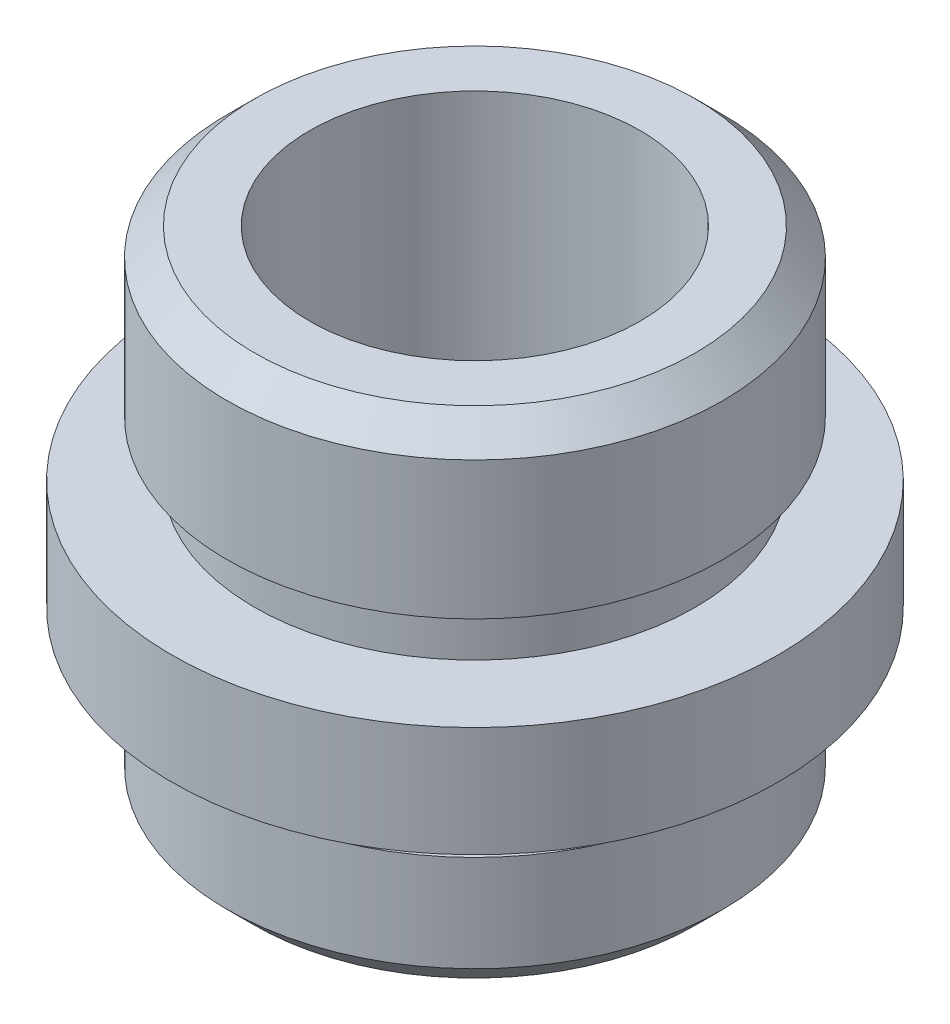
ISO-10303-21;
HEADER;
FILE_DESCRIPTION(('STEP AP214'),'2;1');
FILE_NAME('part.step','',(''),(''),'','','');
FILE_SCHEMA(('AUTOMOTIVE_DESIGN { 1 0 10303 214 1 1 1 1 }'));
ENDSEC;
DATA;
#1=APPLICATION_CONTEXT('core data for automotive mechanical design processes');
#2=APPLICATION_PROTOCOL_DEFINITION('international standard','automotive_design',2000,#1);
#3=PRODUCT_CONTEXT('',#1,'mechanical');
#4=PRODUCT('Part','Part','',(#3));
#5=PRODUCT_RELATED_PRODUCT_CATEGORY('part','',(#4));
#6=PRODUCT_DEFINITION_FORMATION('','',#4);
#7=PRODUCT_DEFINITION_CONTEXT('part definition',#1,'design');
#8=PRODUCT_DEFINITION('design','',#6,#7);
#9=PRODUCT_DEFINITION_SHAPE('','',#8);
#10=(LENGTH_UNIT() NAMED_UNIT(*) SI_UNIT(.MILLI.,.METRE.));
#11=(NAMED_UNIT(*) PLANE_ANGLE_UNIT() SI_UNIT($,.RADIAN.));
#12=(NAMED_UNIT(*) SI_UNIT($,.STERADIAN.) SOLID_ANGLE_UNIT());
#13=UNCERTAINTY_MEASURE_WITH_UNIT(LENGTH_MEASURE(1.E-05),#10,'distance_accuracy_value','');
#14=(GEOMETRIC_REPRESENTATION_CONTEXT(3) GLOBAL_UNCERTAINTY_ASSIGNED_CONTEXT((#13)) GLOBAL_UNIT_ASSIGNED_CONTEXT((#10,
#11,#12)) REPRESENTATION_CONTEXT('',''));
#15=CARTESIAN_POINT('',(0.,0.,0.));
#16=DIRECTION('',(0.,0.,1.));
#17=DIRECTION('',(1.,0.,0.));
#18=AXIS2_PLACEMENT_3D('',#15,#16,#17);
#19=CARTESIAN_POINT('',(-12.,0.,0.));
#20=DIRECTION('',(0.,-1.,0.));
#21=DIRECTION('',(1.,0.,0.));
#22=AXIS2_PLACEMENT_3D('',#19,#20,#21);
#23=PLANE('',#22);
#24=CARTESIAN_POINT('',(0.,0.,0.));
#25=DIRECTION('',(0.,-1.,0.));
#26=DIRECTION('',(1.,0.,0.));
#27=AXIS2_PLACEMENT_3D('',#24,#25,#26);
#28=CIRCLE('',#27,16.);
#29=CARTESIAN_POINT('',(16.,0.,0.));
#30=VERTEX_POINT('',#29);
#31=EDGE_CURVE('E10',#30,#30,#28,.T.);
#32=ORIENTED_EDGE('',*,*,#31,.F.);
#33=EDGE_LOOP('',(#32));
#34=FACE_BOUND('',#33,.T.);
#35=CARTESIAN_POINT('',(0.,0.,0.));
#36=DIRECTION('',(0.,-1.,0.));
#37=DIRECTION('',(1.,0.,0.));
#38=AXIS2_PLACEMENT_3D('',#35,#36,#37);
#39=CIRCLE('',#38,12.);
#40=CARTESIAN_POINT('',(12.,0.,0.));
#41=VERTEX_POINT('',#40);
#42=EDGE_CURVE('E81',#41,#41,#39,.T.);
#43=ORIENTED_EDGE('',*,*,#42,.T.);
#44=EDGE_LOOP('',(#43));
#45=FACE_BOUND('',#44,.T.);
#46=ADVANCED_FACE('F35',(#34,#45),#23,.F.);
#47=CARTESIAN_POINT('',(0.,0.,0.));
#48=DIRECTION('',(0.,-1.,0.));
#49=DIRECTION('',(1.,0.,0.));
#50=AXIS2_PLACEMENT_3D('',#47,#48,#49);
#51=CONICAL_SURFACE('',#50,16.,0.785398163397478);
#52=CARTESIAN_POINT('',(0.,-1.99999999999989,0.));
#53=DIRECTION('',(0.,-1.,0.));
#54=DIRECTION('',(1.,0.,0.));
#55=AXIS2_PLACEMENT_3D('',#52,#53,#54);
#56=CIRCLE('',#55,18.);
#57=CARTESIAN_POINT('',(18.,-1.99999999999983,0.));
#58=VERTEX_POINT('',#57);
#59=EDGE_CURVE('E41',#58,#58,#56,.T.);
#60=ORIENTED_EDGE('',*,*,#59,.F.);
#61=EDGE_LOOP('',(#60));
#62=FACE_BOUND('',#61,.T.);
#63=ORIENTED_EDGE('',*,*,#31,.T.);
#64=EDGE_LOOP('',(#63));
#65=FACE_BOUND('',#64,.T.);
#66=ADVANCED_FACE('F154',(#62,#65),#51,.T.);
#67=CARTESIAN_POINT('',(3.43024899888577E-12,-1000.,0.));
#68=DIRECTION('',(0.,-1.,0.));
#69=DIRECTION('',(1.,0.,0.));
#70=AXIS2_PLACEMENT_3D('',#67,#68,#69);
#71=CYLINDRICAL_SURFACE('',#70,18.);
#72=CARTESIAN_POINT('',(0.,-11.9999999999999,0.));
#73=DIRECTION('',(0.,-1.,0.));
#74=DIRECTION('',(1.,0.,0.));
#75=AXIS2_PLACEMENT_3D('',#72,#73,#74);
#76=CIRCLE('',#75,18.);
#77=CARTESIAN_POINT('',(18.0000000000001,-11.9999999999998,0.));
#78=VERTEX_POINT('',#77);
#79=EDGE_CURVE('E45',#78,#78,#76,.T.);
#80=ORIENTED_EDGE('',*,*,#79,.F.);
#81=EDGE_LOOP('',(#80));
#82=FACE_BOUND('',#81,.T.);
#83=ORIENTED_EDGE('',*,*,#59,.T.);
#84=EDGE_LOOP('',(#83));
#85=FACE_BOUND('',#84,.T.);
#86=ADVANCED_FACE('F149',(#82,#85),#71,.T.);
#87=CARTESIAN_POINT('',(-18.,-12.,0.));
#88=DIRECTION('',(0.,1.,0.));
#89=DIRECTION('',(-1.,0.,0.));
#90=AXIS2_PLACEMENT_3D('',#87,#88,#89);
#91=PLANE('',#90);
#92=CARTESIAN_POINT('',(0.,-12.,0.));
#93=DIRECTION('',(0.,-1.,0.));
#94=DIRECTION('',(1.,0.,0.));
#95=AXIS2_PLACEMENT_3D('',#92,#93,#94);
#96=CIRCLE('',#95,16.);
#97=CARTESIAN_POINT('',(16.0000000000001,-12.,0.));
#98=VERTEX_POINT('',#97);
#99=EDGE_CURVE('E49',#98,#98,#96,.T.);
#100=ORIENTED_EDGE('',*,*,#99,.F.);
#101=EDGE_LOOP('',(#100));
#102=FACE_BOUND('',#101,.T.);
#103=ORIENTED_EDGE('',*,*,#79,.T.);
#104=EDGE_LOOP('',(#103));
#105=FACE_BOUND('',#104,.T.);
#106=ADVANCED_FACE('F143',(#102,#105),#91,.F.);
#107=CARTESIAN_POINT('',(3.43024899888577E-12,-1000.,0.));
#108=DIRECTION('',(0.,-1.,0.));
#109=DIRECTION('',(1.,0.,0.));
#110=AXIS2_PLACEMENT_3D('',#107,#108,#109);
#111=CYLINDRICAL_SURFACE('',#110,16.);
#112=CARTESIAN_POINT('',(0.,-16.,0.));
#113=DIRECTION('',(0.,-1.,0.));
#114=DIRECTION('',(1.,0.,0.));
#115=AXIS2_PLACEMENT_3D('',#112,#113,#114);
#116=CIRCLE('',#115,16.0000000000001);
#117=CARTESIAN_POINT('',(16.0000000000001,-16.,0.));
#118=VERTEX_POINT('',#117);
#119=EDGE_CURVE('E54',#118,#118,#116,.T.);
#120=ORIENTED_EDGE('',*,*,#119,.F.);
#121=EDGE_LOOP('',(#120));
#122=FACE_BOUND('',#121,.T.);
#123=ORIENTED_EDGE('',*,*,#99,.T.);
#124=EDGE_LOOP('',(#123));
#125=FACE_BOUND('',#124,.T.);
#126=ADVANCED_FACE('F137',(#122,#125),#111,.T.);
#127=CARTESIAN_POINT('',(-16.,-16.,0.));
#128=DIRECTION('',(0.,-1.,0.));
#129=DIRECTION('',(1.,0.,0.));
#130=AXIS2_PLACEMENT_3D('',#127,#128,#129);
#131=PLANE('',#130);
#132=CARTESIAN_POINT('',(0.,-15.9999999999999,0.));
#133=DIRECTION('',(0.,-1.,0.));
#134=DIRECTION('',(1.,0.,0.));
#135=AXIS2_PLACEMENT_3D('',#132,#133,#134);
#136=CIRCLE('',#135,22.0000000000001);
#137=CARTESIAN_POINT('',(22.0000000000001,-15.9999999999998,0.));
#138=VERTEX_POINT('',#137);
#139=EDGE_CURVE('E57',#138,#138,#136,.T.);
#140=ORIENTED_EDGE('',*,*,#139,.F.);
#141=EDGE_LOOP('',(#140));
#142=FACE_BOUND('',#141,.T.);
#143=ORIENTED_EDGE('',*,*,#119,.T.);
#144=EDGE_LOOP('',(#143));
#145=FACE_BOUND('',#144,.T.);
#146=ADVANCED_FACE('F131',(#142,#145),#131,.F.);
#147=CARTESIAN_POINT('',(3.43024899888577E-12,-1000.,0.));
#148=DIRECTION('',(0.,-1.,0.));
#149=DIRECTION('',(1.,0.,0.));
#150=AXIS2_PLACEMENT_3D('',#147,#148,#149);
#151=CYLINDRICAL_SURFACE('',#150,22.0000000000001);
#152=CARTESIAN_POINT('',(0.,-23.9999999999999,0.));
#153=DIRECTION('',(0.,-1.,0.));
#154=DIRECTION('',(1.,0.,0.));
#155=AXIS2_PLACEMENT_3D('',#152,#153,#154);
#156=CIRCLE('',#155,22.0000000000001);
#157=CARTESIAN_POINT('',(22.0000000000002,-23.9999999999998,0.));
#158=VERTEX_POINT('',#157);
#159=EDGE_CURVE('E60',#158,#158,#156,.T.);
#160=ORIENTED_EDGE('',*,*,#159,.F.);
#161=EDGE_LOOP('',(#160));
#162=FACE_BOUND('',#161,.T.);
#163=ORIENTED_EDGE('',*,*,#139,.T.);
#164=EDGE_LOOP('',(#163));
#165=FACE_BOUND('',#164,.T.);
#166=ADVANCED_FACE('F125',(#162,#165),#151,.T.);
#167=CARTESIAN_POINT('',(-22.,-24.,0.));
#168=DIRECTION('',(0.,1.,0.));
#169=DIRECTION('',(-1.,0.,0.));
#170=AXIS2_PLACEMENT_3D('',#167,#168,#169);
#171=PLANE('',#170);
#172=CARTESIAN_POINT('',(0.,-24.,0.));
#173=DIRECTION('',(0.,-1.,0.));
#174=DIRECTION('',(1.,0.,0.));
#175=AXIS2_PLACEMENT_3D('',#172,#173,#174);
#176=CIRCLE('',#175,16.0000000000001);
#177=CARTESIAN_POINT('',(16.0000000000002,-24.,0.));
#178=VERTEX_POINT('',#177);
#179=EDGE_CURVE('E63',#178,#178,#176,.T.);
#180=ORIENTED_EDGE('',*,*,#179,.F.);
#181=EDGE_LOOP('',(#180));
#182=FACE_BOUND('',#181,.T.);
#183=ORIENTED_EDGE('',*,*,#159,.T.);
#184=EDGE_LOOP('',(#183));
#185=FACE_BOUND('',#184,.T.);
#186=ADVANCED_FACE('F119',(#182,#185),#171,.F.);
#187=CARTESIAN_POINT('',(3.43024899888577E-12,-1000.,0.));
#188=DIRECTION('',(0.,-1.,0.));
#189=DIRECTION('',(1.,0.,0.));
#190=AXIS2_PLACEMENT_3D('',#187,#188,#189);
#191=CYLINDRICAL_SURFACE('',#190,16.0000000000001);
#192=CARTESIAN_POINT('',(0.,-27.,0.));
#193=DIRECTION('',(0.,-1.,0.));
#194=DIRECTION('',(1.,0.,0.));
#195=AXIS2_PLACEMENT_3D('',#192,#193,#194);
#196=CIRCLE('',#195,16.0000000000001);
#197=CARTESIAN_POINT('',(16.0000000000002,-27.,0.));
#198=VERTEX_POINT('',#197);
#199=EDGE_CURVE('E66',#198,#198,#196,.T.);
#200=ORIENTED_EDGE('',*,*,#199,.F.);
#201=EDGE_LOOP('',(#200));
#202=FACE_BOUND('',#201,.T.);
#203=ORIENTED_EDGE('',*,*,#179,.T.);
#204=EDGE_LOOP('',(#203));
#205=FACE_BOUND('',#204,.T.);
#206=ADVANCED_FACE('F113',(#202,#205),#191,.T.);
#207=CARTESIAN_POINT('',(-16.,-27.,0.));
#208=DIRECTION('',(0.,-1.,0.));
#209=DIRECTION('',(1.,0.,0.));
#210=AXIS2_PLACEMENT_3D('',#207,#208,#209);
#211=PLANE('',#210);
#212=CARTESIAN_POINT('',(0.,-26.9999999999999,0.));
#213=DIRECTION('',(0.,-1.,0.));
#214=DIRECTION('',(1.,0.,0.));
#215=AXIS2_PLACEMENT_3D('',#212,#213,#214);
#216=CIRCLE('',#215,18.0000000000001);
#217=CARTESIAN_POINT('',(18.0000000000002,-26.9999999999999,0.));
#218=VERTEX_POINT('',#217);
#219=EDGE_CURVE('E69',#218,#218,#216,.T.);
#220=ORIENTED_EDGE('',*,*,#219,.F.);
#221=EDGE_LOOP('',(#220));
#222=FACE_BOUND('',#221,.T.);
#223=ORIENTED_EDGE('',*,*,#199,.T.);
#224=EDGE_LOOP('',(#223));
#225=FACE_BOUND('',#224,.T.);
#226=ADVANCED_FACE('F107',(#222,#225),#211,.F.);
#227=CARTESIAN_POINT('',(3.43024899888577E-12,-1000.,0.));
#228=DIRECTION('',(0.,-1.,0.));
#229=DIRECTION('',(1.,0.,0.));
#230=AXIS2_PLACEMENT_3D('',#227,#228,#229);
#231=CYLINDRICAL_SURFACE('',#230,18.0000000000001);
#232=CARTESIAN_POINT('',(1.16628465962115E-13,-33.9999999999999,0.));
#233=DIRECTION('',(0.,-1.,0.));
#234=DIRECTION('',(1.,0.,0.));
#235=AXIS2_PLACEMENT_3D('',#232,#233,#234);
#236=CIRCLE('',#235,18.0000000000001);
#237=CARTESIAN_POINT('',(18.0000000000002,-33.9999999999999,0.));
#238=VERTEX_POINT('',#237);
#239=EDGE_CURVE('E72',#238,#238,#236,.T.);
#240=ORIENTED_EDGE('',*,*,#239,.F.);
#241=EDGE_LOOP('',(#240));
#242=FACE_BOUND('',#241,.T.);
#243=ORIENTED_EDGE('',*,*,#219,.T.);
#244=EDGE_LOOP('',(#243));
#245=FACE_BOUND('',#244,.T.);
#246=ADVANCED_FACE('F101',(#242,#245),#231,.T.);
#247=CARTESIAN_POINT('',(1.16628465962115E-13,-33.9999999999999,0.));
#248=DIRECTION('',(0.,1.,0.));
#249=DIRECTION('',(-1.,0.,0.));
#250=AXIS2_PLACEMENT_3D('',#247,#248,#249);
#251=CONICAL_SURFACE('',#250,18.0000000000001,0.785398163397418);
#252=CARTESIAN_POINT('',(1.23488963959887E-13,-36.,0.));
#253=DIRECTION('',(0.,-1.,0.));
#254=DIRECTION('',(1.,0.,0.));
#255=AXIS2_PLACEMENT_3D('',#252,#253,#254);
#256=CIRCLE('',#255,16.0000000000001);
#257=CARTESIAN_POINT('',(16.0000000000002,-36.,0.));
#258=VERTEX_POINT('',#257);
#259=EDGE_CURVE('E75',#258,#258,#256,.T.);
#260=ORIENTED_EDGE('',*,*,#259,.F.);
#261=EDGE_LOOP('',(#260));
#262=FACE_BOUND('',#261,.T.);
#263=ORIENTED_EDGE('',*,*,#239,.T.);
#264=EDGE_LOOP('',(#263));
#265=FACE_BOUND('',#264,.T.);
#266=ADVANCED_FACE('F95',(#262,#265),#251,.T.);
#267=CARTESIAN_POINT('',(-16.,-36.,0.));
#268=DIRECTION('',(0.,1.,0.));
#269=DIRECTION('',(-1.,0.,0.));
#270=AXIS2_PLACEMENT_3D('',#267,#268,#269);
#271=PLANE('',#270);
#272=CARTESIAN_POINT('',(1.23488963959887E-13,-36.,0.));
#273=DIRECTION('',(0.,-1.,0.));
#274=DIRECTION('',(1.,0.,0.));
#275=AXIS2_PLACEMENT_3D('',#272,#273,#274);
#276=CIRCLE('',#275,12.0000000000001);
#277=CARTESIAN_POINT('',(12.0000000000002,-36.,0.));
#278=VERTEX_POINT('',#277);
#279=EDGE_CURVE('E78',#278,#278,#276,.T.);
#280=ORIENTED_EDGE('',*,*,#279,.F.);
#281=EDGE_LOOP('',(#280));
#282=FACE_BOUND('',#281,.T.);
#283=ORIENTED_EDGE('',*,*,#259,.T.);
#284=EDGE_LOOP('',(#283));
#285=FACE_BOUND('',#284,.T.);
#286=ADVANCED_FACE('F89',(#282,#285),#271,.F.);
#287=CARTESIAN_POINT('',(3.43024899888577E-12,-1000.,0.));
#288=DIRECTION('',(0.,-1.,0.));
#289=DIRECTION('',(1.,0.,0.));
#290=AXIS2_PLACEMENT_3D('',#287,#288,#289);
#291=CYLINDRICAL_SURFACE('',#290,12.0000000000001);
#292=ORIENTED_EDGE('',*,*,#42,.F.);
#293=EDGE_LOOP('',(#292));
#294=FACE_BOUND('',#293,.T.);
#295=ORIENTED_EDGE('',*,*,#279,.T.);
#296=EDGE_LOOP('',(#295));
#297=FACE_BOUND('',#296,.T.);
#298=ADVANCED_FACE('F86',(#294,#297),#291,.F.);
#299=CLOSED_SHELL('',(#46,#66,#86,#106,#126,#146,#166,#186,#206,#226,#246,#266,#286,#298));
#300=MANIFOLD_SOLID_BREP('B2',#299);
#301=ADVANCED_BREP_SHAPE_REPRESENTATION('',(#18,#300),#14);
#302=SHAPE_DEFINITION_REPRESENTATION(#9,#301);
ENDSEC;
END-ISO-10303-21;
